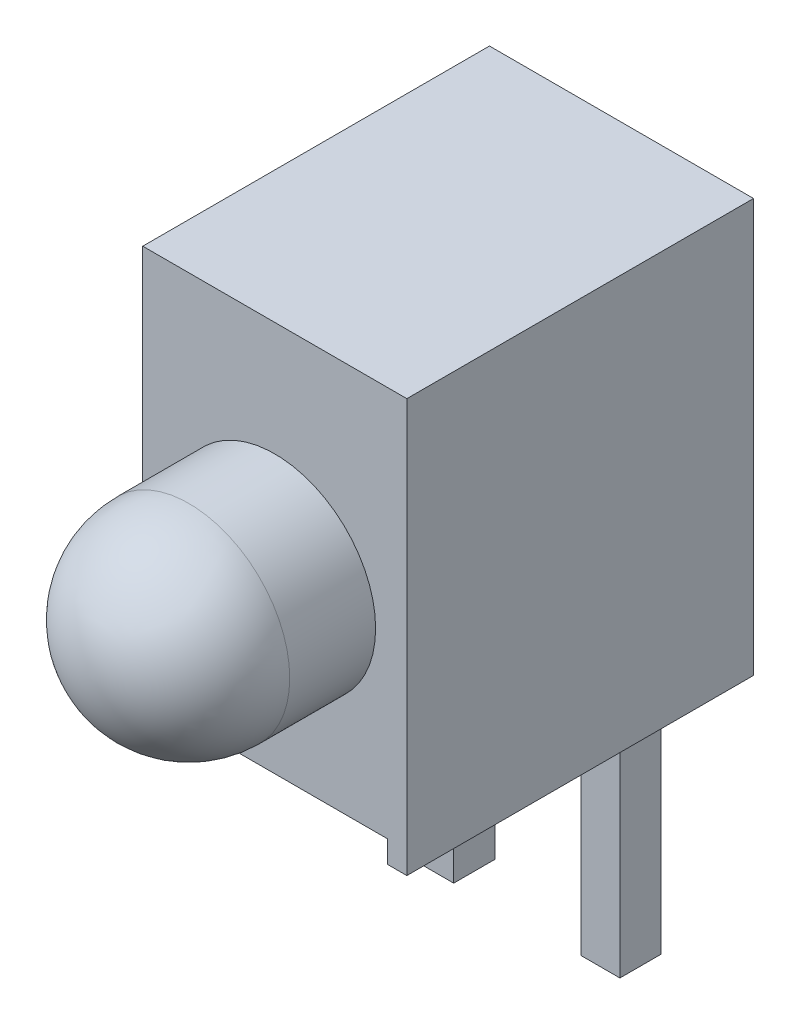
ISO-10303-21;
HEADER;
FILE_DESCRIPTION(('STEP AP214'),'2;1');
FILE_NAME('part.step','',(''),(''),'','','');
FILE_SCHEMA(('AUTOMOTIVE_DESIGN { 1 0 10303 214 1 1 1 1 }'));
ENDSEC;
DATA;
#1=APPLICATION_CONTEXT('core data for automotive mechanical design processes');
#2=APPLICATION_PROTOCOL_DEFINITION('international standard','automotive_design',2000,#1);
#3=PRODUCT_CONTEXT('',#1,'mechanical');
#4=PRODUCT('Part','Part','',(#3));
#5=PRODUCT_RELATED_PRODUCT_CATEGORY('part','',(#4));
#6=PRODUCT_DEFINITION_FORMATION('','',#4);
#7=PRODUCT_DEFINITION_CONTEXT('part definition',#1,'design');
#8=PRODUCT_DEFINITION('design','',#6,#7);
#9=PRODUCT_DEFINITION_SHAPE('','',#8);
#10=(LENGTH_UNIT() NAMED_UNIT(*) SI_UNIT(.MILLI.,.METRE.));
#11=(NAMED_UNIT(*) PLANE_ANGLE_UNIT() SI_UNIT($,.RADIAN.));
#12=(NAMED_UNIT(*) SI_UNIT($,.STERADIAN.) SOLID_ANGLE_UNIT());
#13=UNCERTAINTY_MEASURE_WITH_UNIT(LENGTH_MEASURE(1.E-05),#10,'distance_accuracy_value','');
#14=(GEOMETRIC_REPRESENTATION_CONTEXT(3) GLOBAL_UNCERTAINTY_ASSIGNED_CONTEXT((#13)) GLOBAL_UNIT_ASSIGNED_CONTEXT((#10,
#11,#12)) REPRESENTATION_CONTEXT('',''));
#15=CARTESIAN_POINT('',(0.,0.,0.));
#16=DIRECTION('',(0.,0.,1.));
#17=DIRECTION('',(1.,0.,0.));
#18=AXIS2_PLACEMENT_3D('',#15,#16,#17);
#19=CARTESIAN_POINT('',(-1.76265219475498,0.340679682989574,-2.665));
#20=DIRECTION('',(0.,1.,0.));
#21=DIRECTION('',(0.,0.,1.));
#22=AXIS2_PLACEMENT_3D('',#19,#20,#21);
#23=PLANE('',#22);
#24=DIRECTION('',(0.,0.,1.));
#25=VECTOR('',#24,1.);
#26=CARTESIAN_POINT('',(-0.978193782188084,0.340679682989574,-1.06361068465663));
#27=LINE('',#26,#25);
#28=CARTESIAN_POINT('',(-0.978193782188084,0.340679682989574,-1.69638974033212));
#29=VERTEX_POINT('',#28);
#30=CARTESIAN_POINT('',(-0.978193782188084,0.340679682989574,-1.06361068465663));
#31=VERTEX_POINT('',#30);
#32=EDGE_CURVE('E166',#29,#31,#27,.T.);
#33=ORIENTED_EDGE('',*,*,#32,.F.);
#34=DIRECTION('',(1.,0.,0.));
#35=VECTOR('',#34,1.);
#36=CARTESIAN_POINT('',(-1.57819378218808,0.340679682989574,-1.69638974033212));
#37=LINE('',#36,#35);
#38=CARTESIAN_POINT('',(-1.57819378218808,0.340679682989574,-1.69638974033212));
#39=VERTEX_POINT('',#38);
#40=EDGE_CURVE('E179',#39,#29,#37,.T.);
#41=ORIENTED_EDGE('',*,*,#40,.F.);
#42=DIRECTION('',(0.,0.,-1.));
#43=VECTOR('',#42,1.);
#44=CARTESIAN_POINT('',(-1.57819378218808,0.340679682989574,-1.06361068465663));
#45=LINE('',#44,#43);
#46=CARTESIAN_POINT('',(-1.57819378218808,0.340679682989574,-1.06361068465663));
#47=VERTEX_POINT('',#46);
#48=EDGE_CURVE('E188',#47,#39,#45,.T.);
#49=ORIENTED_EDGE('',*,*,#48,.F.);
#50=DIRECTION('',(-1.,0.,0.));
#51=VECTOR('',#50,1.);
#52=CARTESIAN_POINT('',(-1.57819378218808,0.340679682989574,-1.06361068465663));
#53=LINE('',#52,#51);
#54=EDGE_CURVE('E169',#31,#47,#53,.T.);
#55=ORIENTED_EDGE('',*,*,#54,.F.);
#56=EDGE_LOOP('',(#33,#41,#49,#55));
#57=FACE_BOUND('',#56,.T.);
#58=DIRECTION('',(-1.,0.,0.));
#59=VECTOR('',#58,1.);
#60=CARTESIAN_POINT('',(-1.76265219475498,0.340679682989574,2.665));
#61=LINE('',#60,#59);
#62=CARTESIAN_POINT('',(1.73117626270579,0.340679682989574,2.665));
#63=VERTEX_POINT('',#62);
#64=CARTESIAN_POINT('',(-1.76265219475498,0.340679682989574,2.665));
#65=VERTEX_POINT('',#64);
#66=EDGE_CURVE('E209',#63,#65,#61,.T.);
#67=ORIENTED_EDGE('',*,*,#66,.T.);
#68=DIRECTION('',(0.,0.,1.));
#69=VECTOR('',#68,1.);
#70=CARTESIAN_POINT('',(-1.76265219475498,0.340679682989574,-2.665));
#71=LINE('',#70,#69);
#72=CARTESIAN_POINT('',(-1.76265219475498,0.340679682989574,-2.665));
#73=VERTEX_POINT('',#72);
#74=EDGE_CURVE('E222',#73,#65,#71,.T.);
#75=ORIENTED_EDGE('',*,*,#74,.F.);
#76=DIRECTION('',(-1.,0.,0.));
#77=VECTOR('',#76,1.);
#78=CARTESIAN_POINT('',(-1.76265219475498,0.340679682989574,-2.665));
#79=LINE('',#78,#77);
#80=CARTESIAN_POINT('',(1.73117626270579,0.340679682989574,-2.665));
#81=VERTEX_POINT('',#80);
#82=EDGE_CURVE('E212',#81,#73,#79,.T.);
#83=ORIENTED_EDGE('',*,*,#82,.F.);
#84=DIRECTION('',(0.,0.,1.));
#85=VECTOR('',#84,1.);
#86=CARTESIAN_POINT('',(1.73117626270579,0.340679682989574,-2.665));
#87=LINE('',#86,#85);
#88=EDGE_CURVE('E225',#81,#63,#87,.T.);
#89=ORIENTED_EDGE('',*,*,#88,.T.);
#90=EDGE_LOOP('',(#67,#75,#83,#89));
#91=FACE_BOUND('',#90,.T.);
#92=DIRECTION('',(0.,0.,1.));
#93=VECTOR('',#92,1.);
#94=CARTESIAN_POINT('',(1.56180621781192,0.340679682989574,-1.07861047216225));
#95=LINE('',#94,#93);
#96=CARTESIAN_POINT('',(1.56180621781192,0.340679682989574,-1.71138952783774));
#97=VERTEX_POINT('',#96);
#98=CARTESIAN_POINT('',(1.56180621781192,0.340679682989574,-1.07861047216225));
#99=VERTEX_POINT('',#98);
#100=EDGE_CURVE('E165',#97,#99,#95,.T.);
#101=ORIENTED_EDGE('',*,*,#100,.F.);
#102=DIRECTION('',(1.,0.,0.));
#103=VECTOR('',#102,1.);
#104=CARTESIAN_POINT('',(0.961806217811916,0.340679682989574,-1.71138952783774));
#105=LINE('',#104,#103);
#106=CARTESIAN_POINT('',(0.961806217811916,0.340679682989574,-1.71138952783774));
#107=VERTEX_POINT('',#106);
#108=EDGE_CURVE('E162',#107,#97,#105,.T.);
#109=ORIENTED_EDGE('',*,*,#108,.F.);
#110=DIRECTION('',(0.,0.,-1.));
#111=VECTOR('',#110,1.);
#112=CARTESIAN_POINT('',(0.961806217811916,0.340679682989574,-1.07861047216225));
#113=LINE('',#112,#111);
#114=CARTESIAN_POINT('',(0.961806217811916,0.340679682989574,-1.07861047216225));
#115=VERTEX_POINT('',#114);
#116=EDGE_CURVE('E52',#115,#107,#113,.T.);
#117=ORIENTED_EDGE('',*,*,#116,.F.);
#118=DIRECTION('',(-1.,0.,0.));
#119=VECTOR('',#118,1.);
#120=CARTESIAN_POINT('',(0.961806217811916,0.340679682989574,-1.07861047216225));
#121=LINE('',#120,#119);
#122=EDGE_CURVE('E47',#99,#115,#121,.T.);
#123=ORIENTED_EDGE('',*,*,#122,.F.);
#124=EDGE_LOOP('',(#101,#109,#117,#123));
#125=FACE_BOUND('',#124,.T.);
#126=ADVANCED_FACE('F32',(#57,#91,#125),#23,.F.);
#127=CARTESIAN_POINT('',(2.03,0.,2.665));
#128=DIRECTION('',(0.,1.,0.));
#129=DIRECTION('',(0.,0.,1.));
#130=AXIS2_PLACEMENT_3D('',#127,#128,#129);
#131=PLANE('',#130);
#132=DIRECTION('',(-1.,0.,0.));
#133=VECTOR('',#132,1.);
#134=CARTESIAN_POINT('',(-2.03,0.,-2.665));
#135=LINE('',#134,#133);
#136=CARTESIAN_POINT('',(-1.76265219475498,0.,-2.665));
#137=VERTEX_POINT('',#136);
#138=CARTESIAN_POINT('',(-2.03,0.,-2.665));
#139=VERTEX_POINT('',#138);
#140=EDGE_CURVE('E244',#137,#139,#135,.T.);
#141=ORIENTED_EDGE('',*,*,#140,.F.);
#142=DIRECTION('',(0.,0.,1.));
#143=VECTOR('',#142,1.);
#144=CARTESIAN_POINT('',(-1.76265219475498,0.,-2.665));
#145=LINE('',#144,#143);
#146=CARTESIAN_POINT('',(-1.76265219475498,0.,2.665));
#147=VERTEX_POINT('',#146);
#148=EDGE_CURVE('E215',#137,#147,#145,.T.);
#149=ORIENTED_EDGE('',*,*,#148,.T.);
#150=DIRECTION('',(1.,0.,0.));
#151=VECTOR('',#150,1.);
#152=CARTESIAN_POINT('',(-2.03,0.,2.665));
#153=LINE('',#152,#151);
#154=CARTESIAN_POINT('',(-2.03,0.,2.665));
#155=VERTEX_POINT('',#154);
#156=EDGE_CURVE('E235',#155,#147,#153,.T.);
#157=ORIENTED_EDGE('',*,*,#156,.F.);
#158=DIRECTION('',(0.,0.,1.));
#159=VECTOR('',#158,1.);
#160=CARTESIAN_POINT('',(-2.03,0.,-2.665));
#161=LINE('',#160,#159);
#162=EDGE_CURVE('E248',#139,#155,#161,.T.);
#163=ORIENTED_EDGE('',*,*,#162,.F.);
#164=EDGE_LOOP('',(#141,#149,#157,#163));
#165=FACE_BOUND('',#164,.T.);
#166=ADVANCED_FACE('F271',(#165),#131,.F.);
#167=CARTESIAN_POINT('',(-2.03,6.35,2.665));
#168=DIRECTION('',(0.,0.,-1.));
#169=DIRECTION('',(-1.,0.,0.));
#170=AXIS2_PLACEMENT_3D('',#167,#168,#169);
#171=PLANE('',#170);
#172=ORIENTED_EDGE('',*,*,#156,.T.);
#173=DIRECTION('',(0.,-1.,0.));
#174=VECTOR('',#173,1.);
#175=CARTESIAN_POINT('',(-1.76265219475498,0.,2.665));
#176=LINE('',#175,#174);
#177=EDGE_CURVE('E204',#65,#147,#176,.T.);
#178=ORIENTED_EDGE('',*,*,#177,.F.);
#179=ORIENTED_EDGE('',*,*,#66,.F.);
#180=DIRECTION('',(0.,1.,0.));
#181=VECTOR('',#180,1.);
#182=CARTESIAN_POINT('',(1.73117626270579,0.,2.665));
#183=LINE('',#182,#181);
#184=CARTESIAN_POINT('',(1.73117626270579,0.,2.665));
#185=VERTEX_POINT('',#184);
#186=EDGE_CURVE('E217',#185,#63,#183,.T.);
#187=ORIENTED_EDGE('',*,*,#186,.F.);
#188=CARTESIAN_POINT('',(2.03,0.,2.665));
#189=VERTEX_POINT('',#188);
#190=EDGE_CURVE('E250',#185,#189,#153,.T.);
#191=ORIENTED_EDGE('',*,*,#190,.T.);
#192=DIRECTION('',(0.,-1.,0.));
#193=VECTOR('',#192,1.);
#194=CARTESIAN_POINT('',(2.03,6.35,2.665));
#195=LINE('',#194,#193);
#196=CARTESIAN_POINT('',(2.03,6.35,2.665));
#197=VERTEX_POINT('',#196);
#198=EDGE_CURVE('E241',#197,#189,#195,.T.);
#199=ORIENTED_EDGE('',*,*,#198,.F.);
#200=DIRECTION('',(1.,0.,0.));
#201=VECTOR('',#200,1.);
#202=CARTESIAN_POINT('',(-2.03,6.35,2.665));
#203=LINE('',#202,#201);
#204=CARTESIAN_POINT('',(-2.03,6.35,2.665));
#205=VERTEX_POINT('',#204);
#206=EDGE_CURVE('E239',#205,#197,#203,.T.);
#207=ORIENTED_EDGE('',*,*,#206,.F.);
#208=DIRECTION('',(0.,-1.,0.));
#209=VECTOR('',#208,1.);
#210=CARTESIAN_POINT('',(-2.03,6.35,2.665));
#211=LINE('',#210,#209);
#212=EDGE_CURVE('E255',#205,#155,#211,.T.);
#213=ORIENTED_EDGE('',*,*,#212,.T.);
#214=EDGE_LOOP('',(#172,#178,#179,#187,#191,#199,#207,#213));
#215=FACE_BOUND('',#214,.T.);
#216=CARTESIAN_POINT('',(0.,3.05,2.665));
#217=DIRECTION('',(0.,0.,-1.));
#218=DIRECTION('',(-1.,0.,0.));
#219=AXIS2_PLACEMENT_3D('',#216,#217,#218);
#220=CIRCLE('',#219,1.55);
#221=CARTESIAN_POINT('',(-1.55,3.05,2.665));
#222=VERTEX_POINT('',#221);
#223=EDGE_CURVE('E40',#222,#222,#220,.F.);
#224=ORIENTED_EDGE('',*,*,#223,.F.);
#225=EDGE_LOOP('',(#224));
#226=FACE_BOUND('',#225,.T.);
#227=ADVANCED_FACE('F268',(#215,#226),#171,.F.);
#228=CARTESIAN_POINT('',(2.03,6.35,-2.665));
#229=DIRECTION('',(-1.,0.,0.));
#230=DIRECTION('',(0.,0.,1.));
#231=AXIS2_PLACEMENT_3D('',#228,#229,#230);
#232=PLANE('',#231);
#233=DIRECTION('',(0.,0.,-1.));
#234=VECTOR('',#233,1.);
#235=CARTESIAN_POINT('',(2.03,0.,-2.665));
#236=LINE('',#235,#234);
#237=CARTESIAN_POINT('',(2.03,0.,-2.665));
#238=VERTEX_POINT('',#237);
#239=EDGE_CURVE('E224',#189,#238,#236,.T.);
#240=ORIENTED_EDGE('',*,*,#239,.T.);
#241=DIRECTION('',(0.,-1.,0.));
#242=VECTOR('',#241,1.);
#243=CARTESIAN_POINT('',(2.03,6.35,-2.665));
#244=LINE('',#243,#242);
#245=CARTESIAN_POINT('',(2.03,6.35,-2.665));
#246=VERTEX_POINT('',#245);
#247=EDGE_CURVE('E261',#246,#238,#244,.T.);
#248=ORIENTED_EDGE('',*,*,#247,.F.);
#249=DIRECTION('',(0.,0.,-1.));
#250=VECTOR('',#249,1.);
#251=CARTESIAN_POINT('',(2.03,6.35,-2.665));
#252=LINE('',#251,#250);
#253=EDGE_CURVE('E231',#197,#246,#252,.T.);
#254=ORIENTED_EDGE('',*,*,#253,.F.);
#255=ORIENTED_EDGE('',*,*,#198,.T.);
#256=EDGE_LOOP('',(#240,#248,#254,#255));
#257=FACE_BOUND('',#256,.T.);
#258=ADVANCED_FACE('F270',(#257),#232,.F.);
#259=CARTESIAN_POINT('',(-2.03,6.35,-2.665));
#260=DIRECTION('',(0.,0.,1.));
#261=DIRECTION('',(1.,0.,0.));
#262=AXIS2_PLACEMENT_3D('',#259,#260,#261);
#263=PLANE('',#262);
#264=ORIENTED_EDGE('',*,*,#82,.T.);
#265=DIRECTION('',(0.,-1.,0.));
#266=VECTOR('',#265,1.);
#267=CARTESIAN_POINT('',(-1.76265219475498,0.,-2.665));
#268=LINE('',#267,#266);
#269=EDGE_CURVE('E205',#73,#137,#268,.T.);
#270=ORIENTED_EDGE('',*,*,#269,.T.);
#271=ORIENTED_EDGE('',*,*,#140,.T.);
#272=DIRECTION('',(0.,-1.,0.));
#273=VECTOR('',#272,1.);
#274=CARTESIAN_POINT('',(-2.03,6.35,-2.665));
#275=LINE('',#274,#273);
#276=CARTESIAN_POINT('',(-2.03,6.35,-2.665));
#277=VERTEX_POINT('',#276);
#278=EDGE_CURVE('E258',#277,#139,#275,.T.);
#279=ORIENTED_EDGE('',*,*,#278,.F.);
#280=DIRECTION('',(-1.,0.,0.));
#281=VECTOR('',#280,1.);
#282=CARTESIAN_POINT('',(-2.03,6.35,-2.665));
#283=LINE('',#282,#281);
#284=EDGE_CURVE('E234',#246,#277,#283,.T.);
#285=ORIENTED_EDGE('',*,*,#284,.F.);
#286=ORIENTED_EDGE('',*,*,#247,.T.);
#287=CARTESIAN_POINT('',(1.73117626270579,0.,-2.665));
#288=VERTEX_POINT('',#287);
#289=EDGE_CURVE('E245',#238,#288,#135,.T.);
#290=ORIENTED_EDGE('',*,*,#289,.T.);
#291=DIRECTION('',(0.,1.,0.));
#292=VECTOR('',#291,1.);
#293=CARTESIAN_POINT('',(1.73117626270579,0.,-2.665));
#294=LINE('',#293,#292);
#295=EDGE_CURVE('E208',#288,#81,#294,.T.);
#296=ORIENTED_EDGE('',*,*,#295,.T.);
#297=EDGE_LOOP('',(#264,#270,#271,#279,#285,#286,#290,#296));
#298=FACE_BOUND('',#297,.T.);
#299=ADVANCED_FACE('F278',(#298),#263,.F.);
#300=CARTESIAN_POINT('',(-2.03,6.35,-2.665));
#301=DIRECTION('',(1.,0.,0.));
#302=DIRECTION('',(0.,0.,-1.));
#303=AXIS2_PLACEMENT_3D('',#300,#301,#302);
#304=PLANE('',#303);
#305=ORIENTED_EDGE('',*,*,#162,.T.);
#306=ORIENTED_EDGE('',*,*,#212,.F.);
#307=DIRECTION('',(0.,0.,1.));
#308=VECTOR('',#307,1.);
#309=CARTESIAN_POINT('',(-2.03,6.35,-2.665));
#310=LINE('',#309,#308);
#311=EDGE_CURVE('E237',#277,#205,#310,.T.);
#312=ORIENTED_EDGE('',*,*,#311,.F.);
#313=ORIENTED_EDGE('',*,*,#278,.T.);
#314=EDGE_LOOP('',(#305,#306,#312,#313));
#315=FACE_BOUND('',#314,.T.);
#316=ADVANCED_FACE('F307',(#315),#304,.F.);
#317=CARTESIAN_POINT('',(2.03,6.35,2.665));
#318=DIRECTION('',(0.,1.,0.));
#319=DIRECTION('',(0.,0.,1.));
#320=AXIS2_PLACEMENT_3D('',#317,#318,#319);
#321=PLANE('',#320);
#322=ORIENTED_EDGE('',*,*,#253,.T.);
#323=ORIENTED_EDGE('',*,*,#284,.T.);
#324=ORIENTED_EDGE('',*,*,#311,.T.);
#325=ORIENTED_EDGE('',*,*,#206,.T.);
#326=EDGE_LOOP('',(#322,#323,#324,#325));
#327=FACE_BOUND('',#326,.T.);
#328=ADVANCED_FACE('F305',(#327),#321,.T.);
#329=ORIENTED_EDGE('',*,*,#190,.F.);
#330=DIRECTION('',(0.,0.,1.));
#331=VECTOR('',#330,1.);
#332=CARTESIAN_POINT('',(1.73117626270579,0.,-2.665));
#333=LINE('',#332,#331);
#334=EDGE_CURVE('E227',#288,#185,#333,.T.);
#335=ORIENTED_EDGE('',*,*,#334,.F.);
#336=ORIENTED_EDGE('',*,*,#289,.F.);
#337=ORIENTED_EDGE('',*,*,#239,.F.);
#338=EDGE_LOOP('',(#329,#335,#336,#337));
#339=FACE_BOUND('',#338,.T.);
#340=ADVANCED_FACE('F282',(#339),#131,.F.);
#341=CARTESIAN_POINT('',(0.,3.05,5.5352));
#342=DIRECTION('',(0.,0.,-1.));
#343=DIRECTION('',(-1.,0.,0.));
#344=AXIS2_PLACEMENT_3D('',#341,#342,#343);
#345=CYLINDRICAL_SURFACE('',#344,1.55);
#346=CARTESIAN_POINT('',(0.,3.05,3.9852));
#347=DIRECTION('',(0.,0.,-1.));
#348=DIRECTION('',(-1.,0.,0.));
#349=AXIS2_PLACEMENT_3D('',#346,#347,#348);
#350=CIRCLE('',#349,1.55);
#351=CARTESIAN_POINT('',(-1.55,3.05,3.9852));
#352=VERTEX_POINT('',#351);
#353=EDGE_CURVE('E11',#352,#352,#350,.T.);
#354=CARTESIAN_POINT('',(-1.55,3.05,3.9852));
#355=CARTESIAN_POINT('',(-1.55,3.05,3.97144791666667));
#356=CARTESIAN_POINT('',(-1.55,3.05,3.95769583333334));
#357=CARTESIAN_POINT('',(-1.55,3.05,3.93019166666667));
#358=CARTESIAN_POINT('',(-1.55,3.05,3.91643958333334));
#359=CARTESIAN_POINT('',(-1.55,3.05,3.88893541666667));
#360=CARTESIAN_POINT('',(-1.55,3.05,3.87518333333334));
#361=CARTESIAN_POINT('',(-1.55,3.05,3.84767916666667));
#362=CARTESIAN_POINT('',(-1.55,3.05,3.83392708333334));
#363=CARTESIAN_POINT('',(-1.55,3.05,3.80642291666667));
#364=CARTESIAN_POINT('',(-1.55,3.05,3.79267083333334));
#365=CARTESIAN_POINT('',(-1.55,3.05,3.76516666666667));
#366=CARTESIAN_POINT('',(-1.55,3.05,3.75141458333334));
#367=CARTESIAN_POINT('',(-1.55,3.05,3.72391041666667));
#368=CARTESIAN_POINT('',(-1.55,3.05,3.71015833333334));
#369=CARTESIAN_POINT('',(-1.55,3.05,3.68265416666667));
#370=CARTESIAN_POINT('',(-1.55,3.05,3.66890208333334));
#371=CARTESIAN_POINT('',(-1.55,3.05,3.64139791666667));
#372=CARTESIAN_POINT('',(-1.55,3.05,3.62764583333334));
#373=CARTESIAN_POINT('',(-1.55,3.05,3.60014166666667));
#374=CARTESIAN_POINT('',(-1.55,3.05,3.58638958333334));
#375=CARTESIAN_POINT('',(-1.55,3.05,3.55888541666667));
#376=CARTESIAN_POINT('',(-1.55,3.05,3.54513333333334));
#377=CARTESIAN_POINT('',(-1.55,3.05,3.51762916666667));
#378=CARTESIAN_POINT('',(-1.55,3.05,3.50387708333334));
#379=CARTESIAN_POINT('',(-1.55,3.05,3.47637291666667));
#380=CARTESIAN_POINT('',(-1.55,3.05,3.46262083333334));
#381=CARTESIAN_POINT('',(-1.55,3.05,3.43511666666667));
#382=CARTESIAN_POINT('',(-1.55,3.05,3.42136458333334));
#383=CARTESIAN_POINT('',(-1.55,3.05,3.39386041666667));
#384=CARTESIAN_POINT('',(-1.55,3.05,3.38010833333334));
#385=CARTESIAN_POINT('',(-1.55,3.05,3.35260416666667));
#386=CARTESIAN_POINT('',(-1.55,3.05,3.33885208333334));
#387=CARTESIAN_POINT('',(-1.55,3.05,3.31134791666667));
#388=CARTESIAN_POINT('',(-1.55,3.05,3.29759583333334));
#389=CARTESIAN_POINT('',(-1.55,3.05,3.27009166666667));
#390=CARTESIAN_POINT('',(-1.55,3.05,3.25633958333334));
#391=CARTESIAN_POINT('',(-1.55,3.05,3.22883541666667));
#392=CARTESIAN_POINT('',(-1.55,3.05,3.21508333333334));
#393=CARTESIAN_POINT('',(-1.55,3.05,3.18757916666667));
#394=CARTESIAN_POINT('',(-1.55,3.05,3.17382708333334));
#395=CARTESIAN_POINT('',(-1.55,3.05,3.14632291666667));
#396=CARTESIAN_POINT('',(-1.55,3.05,3.13257083333334));
#397=CARTESIAN_POINT('',(-1.55,3.05,3.10506666666667));
#398=CARTESIAN_POINT('',(-1.55,3.05,3.09131458333334));
#399=CARTESIAN_POINT('',(-1.55,3.05,3.06381041666667));
#400=CARTESIAN_POINT('',(-1.55,3.05,3.05005833333334));
#401=CARTESIAN_POINT('',(-1.55,3.05,3.02255416666667));
#402=CARTESIAN_POINT('',(-1.55,3.05,3.00880208333334));
#403=CARTESIAN_POINT('',(-1.55,3.05,2.98129791666667));
#404=CARTESIAN_POINT('',(-1.55,3.05,2.96754583333334));
#405=CARTESIAN_POINT('',(-1.55,3.05,2.94004166666667));
#406=CARTESIAN_POINT('',(-1.55,3.05,2.92628958333334));
#407=CARTESIAN_POINT('',(-1.55,3.05,2.89878541666667));
#408=CARTESIAN_POINT('',(-1.55,3.05,2.88503333333334));
#409=CARTESIAN_POINT('',(-1.55,3.05,2.85752916666667));
#410=CARTESIAN_POINT('',(-1.55,3.05,2.84377708333334));
#411=CARTESIAN_POINT('',(-1.55,3.05,2.81627291666667));
#412=CARTESIAN_POINT('',(-1.55,3.05,2.80252083333334));
#413=CARTESIAN_POINT('',(-1.55,3.05,2.77501666666667));
#414=CARTESIAN_POINT('',(-1.55,3.05,2.76126458333334));
#415=CARTESIAN_POINT('',(-1.55,3.05,2.73376041666667));
#416=CARTESIAN_POINT('',(-1.55,3.05,2.72000833333334));
#417=CARTESIAN_POINT('',(-1.55,3.05,2.69250416666667));
#418=CARTESIAN_POINT('',(-1.55,3.05,2.67875208333334));
#419=CARTESIAN_POINT('',(-1.55,3.05,2.665));
#420=B_SPLINE_CURVE_WITH_KNOTS('',3,(#354,#355,#356,#357,#358,#359,#360,#361,#362,#363,#364,
#365,#366,#367,#368,#369,#370,#371,#372,#373,#374,#375,#376,#377,#378,#379,#380,#381,#382,#383,
#384,#385,#386,#387,#388,#389,#390,#391,#392,#393,#394,#395,#396,#397,#398,#399,#400,#401,#402,
#403,#404,#405,#406,#407,#408,#409,#410,#411,#412,#413,#414,#415,#416,#417,#418,#419),
.UNSPECIFIED.,.F.,.F.,(4,2,2,2,2,2,2,2,2,2,2,2,2,2,2,2,2,2,2,2,2,2,2,2,2,2,2,2,2,2,2,2,4),(0.,
0.0412562499999998,0.0825124999999996,0.12376875,0.165025,0.20628125,0.2475375,0.28879375,
0.33005,0.37130625,0.4125625,0.45381875,0.495075,0.53633125,0.5775875,0.61884375,0.6601,
0.70135625,0.7426125,0.78386875,0.825125,0.86638125,0.9076375,0.94889375,0.99015,1.03140625,
1.0726625,1.11391875,1.155175,1.19643125,1.2376875,1.27894375,1.3202),.UNSPECIFIED.);
#421=EDGE_CURVE('BSEAM266',#352,#222,#420,.T.);
#422=ORIENTED_EDGE('',*,*,#353,.T.);
#423=ORIENTED_EDGE('',*,*,#223,.T.);
#424=ORIENTED_EDGE('',*,*,#421,.T.);
#425=ORIENTED_EDGE('',*,*,#421,.F.);
#426=EDGE_LOOP('',(#422,#424,#423,#425));
#427=FACE_BOUND('',#426,.T.);
#428=ADVANCED_FACE('F266',(#427),#345,.T.);
#429=CARTESIAN_POINT('',(0.,3.05,3.9852));
#430=DIRECTION('',(0.,0.,1.));
#431=DIRECTION('',(1.,0.,0.));
#432=AXIS2_PLACEMENT_3D('',#429,#430,#431);
#433=SPHERICAL_SURFACE('',#432,1.55);
#434=ORIENTED_EDGE('',*,*,#353,.F.);
#435=EDGE_LOOP('',(#434));
#436=FACE_BOUND('',#435,.T.);
#437=ADVANCED_FACE('F34',(#436),#433,.T.);
#438=CARTESIAN_POINT('',(-1.76265219475498,0.,-2.665));
#439=DIRECTION('',(-1.,0.,0.));
#440=DIRECTION('',(0.,0.,1.));
#441=AXIS2_PLACEMENT_3D('',#438,#439,#440);
#442=PLANE('',#441);
#443=ORIENTED_EDGE('',*,*,#177,.T.);
#444=ORIENTED_EDGE('',*,*,#148,.F.);
#445=ORIENTED_EDGE('',*,*,#269,.F.);
#446=ORIENTED_EDGE('',*,*,#74,.T.);
#447=EDGE_LOOP('',(#443,#444,#445,#446));
#448=FACE_BOUND('',#447,.T.);
#449=ADVANCED_FACE('F297',(#448),#442,.F.);
#450=CARTESIAN_POINT('',(1.73117626270579,0.,-2.665));
#451=DIRECTION('',(1.,0.,0.));
#452=DIRECTION('',(0.,0.,-1.));
#453=AXIS2_PLACEMENT_3D('',#450,#451,#452);
#454=PLANE('',#453);
#455=ORIENTED_EDGE('',*,*,#186,.T.);
#456=ORIENTED_EDGE('',*,*,#88,.F.);
#457=ORIENTED_EDGE('',*,*,#295,.F.);
#458=ORIENTED_EDGE('',*,*,#334,.T.);
#459=EDGE_LOOP('',(#455,#456,#457,#458));
#460=FACE_BOUND('',#459,.T.);
#461=ADVANCED_FACE('F294',(#460),#454,.F.);
#462=CARTESIAN_POINT('',(-0.978193782188084,-3.46932031701043,-1.06361068465663));
#463=DIRECTION('',(-1.,0.,0.));
#464=DIRECTION('',(0.,0.,1.));
#465=AXIS2_PLACEMENT_3D('',#462,#463,#464);
#466=PLANE('',#465);
#467=ORIENTED_EDGE('',*,*,#32,.T.);
#468=DIRECTION('',(0.,1.,0.));
#469=VECTOR('',#468,1.);
#470=CARTESIAN_POINT('',(-0.978193782188084,-3.46932031701043,-1.06361068465663));
#471=LINE('',#470,#469);
#472=CARTESIAN_POINT('',(-0.978193782188084,-3.46932031701043,-1.06361068465663));
#473=VERTEX_POINT('',#472);
#474=EDGE_CURVE('E201',#473,#31,#471,.T.);
#475=ORIENTED_EDGE('',*,*,#474,.F.);
#476=DIRECTION('',(0.,0.,1.));
#477=VECTOR('',#476,1.);
#478=CARTESIAN_POINT('',(-0.978193782188084,-3.46932031701043,-1.06361068465663));
#479=LINE('',#478,#477);
#480=CARTESIAN_POINT('',(-0.978193782188084,-3.46932031701043,-1.69638974033212));
#481=VERTEX_POINT('',#480);
#482=EDGE_CURVE('E175',#481,#473,#479,.T.);
#483=ORIENTED_EDGE('',*,*,#482,.F.);
#484=DIRECTION('',(0.,1.,0.));
#485=VECTOR('',#484,1.);
#486=CARTESIAN_POINT('',(-0.978193782188084,-3.46932031701043,-1.69638974033212));
#487=LINE('',#486,#485);
#488=EDGE_CURVE('E184',#481,#29,#487,.T.);
#489=ORIENTED_EDGE('',*,*,#488,.T.);
#490=EDGE_LOOP('',(#467,#475,#483,#489));
#491=FACE_BOUND('',#490,.T.);
#492=ADVANCED_FACE('F292',(#491),#466,.F.);
#493=CARTESIAN_POINT('',(-1.57819378218808,-3.46932031701043,-1.06361068465663));
#494=DIRECTION('',(0.,0.,-1.));
#495=DIRECTION('',(-1.,0.,0.));
#496=AXIS2_PLACEMENT_3D('',#493,#494,#495);
#497=PLANE('',#496);
#498=ORIENTED_EDGE('',*,*,#54,.T.);
#499=DIRECTION('',(0.,1.,0.));
#500=VECTOR('',#499,1.);
#501=CARTESIAN_POINT('',(-1.57819378218808,-3.46932031701043,-1.06361068465663));
#502=LINE('',#501,#500);
#503=CARTESIAN_POINT('',(-1.57819378218808,-3.46932031701043,-1.06361068465663));
#504=VERTEX_POINT('',#503);
#505=EDGE_CURVE('E198',#504,#47,#502,.T.);
#506=ORIENTED_EDGE('',*,*,#505,.F.);
#507=DIRECTION('',(-1.,0.,0.));
#508=VECTOR('',#507,1.);
#509=CARTESIAN_POINT('',(-1.57819378218808,-3.46932031701043,-1.06361068465663));
#510=LINE('',#509,#508);
#511=EDGE_CURVE('E178',#473,#504,#510,.T.);
#512=ORIENTED_EDGE('',*,*,#511,.F.);
#513=ORIENTED_EDGE('',*,*,#474,.T.);
#514=EDGE_LOOP('',(#498,#506,#512,#513));
#515=FACE_BOUND('',#514,.T.);
#516=ADVANCED_FACE('F370',(#515),#497,.F.);
#517=CARTESIAN_POINT('',(-1.57819378218808,-3.46932031701043,-1.06361068465663));
#518=DIRECTION('',(1.,0.,0.));
#519=DIRECTION('',(0.,0.,-1.));
#520=AXIS2_PLACEMENT_3D('',#517,#518,#519);
#521=PLANE('',#520);
#522=ORIENTED_EDGE('',*,*,#48,.T.);
#523=DIRECTION('',(0.,1.,0.));
#524=VECTOR('',#523,1.);
#525=CARTESIAN_POINT('',(-1.57819378218808,-3.46932031701043,-1.69638974033212));
#526=LINE('',#525,#524);
#527=CARTESIAN_POINT('',(-1.57819378218808,-3.46932031701043,-1.69638974033212));
#528=VERTEX_POINT('',#527);
#529=EDGE_CURVE('E195',#528,#39,#526,.T.);
#530=ORIENTED_EDGE('',*,*,#529,.F.);
#531=DIRECTION('',(0.,0.,-1.));
#532=VECTOR('',#531,1.);
#533=CARTESIAN_POINT('',(-1.57819378218808,-3.46932031701043,-1.06361068465663));
#534=LINE('',#533,#532);
#535=EDGE_CURVE('E181',#504,#528,#534,.T.);
#536=ORIENTED_EDGE('',*,*,#535,.F.);
#537=ORIENTED_EDGE('',*,*,#505,.T.);
#538=EDGE_LOOP('',(#522,#530,#536,#537));
#539=FACE_BOUND('',#538,.T.);
#540=ADVANCED_FACE('F367',(#539),#521,.F.);
#541=CARTESIAN_POINT('',(-1.57819378218808,-3.46932031701043,-1.69638974033212));
#542=DIRECTION('',(0.,0.,1.));
#543=DIRECTION('',(1.,0.,0.));
#544=AXIS2_PLACEMENT_3D('',#541,#542,#543);
#545=PLANE('',#544);
#546=ORIENTED_EDGE('',*,*,#40,.T.);
#547=ORIENTED_EDGE('',*,*,#488,.F.);
#548=DIRECTION('',(1.,0.,0.));
#549=VECTOR('',#548,1.);
#550=CARTESIAN_POINT('',(-1.57819378218808,-3.46932031701043,-1.69638974033212));
#551=LINE('',#550,#549);
#552=EDGE_CURVE('E183',#528,#481,#551,.T.);
#553=ORIENTED_EDGE('',*,*,#552,.F.);
#554=ORIENTED_EDGE('',*,*,#529,.T.);
#555=EDGE_LOOP('',(#546,#547,#553,#554));
#556=FACE_BOUND('',#555,.T.);
#557=ADVANCED_FACE('F363',(#556),#545,.F.);
#558=CARTESIAN_POINT('',(-0.978193782188084,-3.46932031701043,-1.69638974033212));
#559=DIRECTION('',(0.,-1.,0.));
#560=DIRECTION('',(0.,0.,-1.));
#561=AXIS2_PLACEMENT_3D('',#558,#559,#560);
#562=PLANE('',#561);
#563=ORIENTED_EDGE('',*,*,#482,.T.);
#564=ORIENTED_EDGE('',*,*,#511,.T.);
#565=ORIENTED_EDGE('',*,*,#535,.T.);
#566=ORIENTED_EDGE('',*,*,#552,.T.);
#567=EDGE_LOOP('',(#563,#564,#565,#566));
#568=FACE_BOUND('',#567,.T.);
#569=ADVANCED_FACE('F360',(#568),#562,.T.);
#570=CARTESIAN_POINT('',(1.56180621781192,-3.46932031701043,-1.07861047216225));
#571=DIRECTION('',(-1.,0.,0.));
#572=DIRECTION('',(0.,0.,1.));
#573=AXIS2_PLACEMENT_3D('',#570,#571,#572);
#574=PLANE('',#573);
#575=ORIENTED_EDGE('',*,*,#100,.T.);
#576=DIRECTION('',(0.,1.,0.));
#577=VECTOR('',#576,1.);
#578=CARTESIAN_POINT('',(1.56180621781192,-3.46932031701043,-1.07861047216225));
#579=LINE('',#578,#577);
#580=CARTESIAN_POINT('',(1.56180621781192,-3.46932031701043,-1.07861047216225));
#581=VERTEX_POINT('',#580);
#582=EDGE_CURVE('E146',#581,#99,#579,.T.);
#583=ORIENTED_EDGE('',*,*,#582,.F.);
#584=DIRECTION('',(0.,0.,1.));
#585=VECTOR('',#584,1.);
#586=CARTESIAN_POINT('',(1.56180621781192,-3.46932031701043,-1.07861047216225));
#587=LINE('',#586,#585);
#588=CARTESIAN_POINT('',(1.56180621781192,-3.46932031701043,-1.71138952783774));
#589=VERTEX_POINT('',#588);
#590=EDGE_CURVE('E153',#589,#581,#587,.T.);
#591=ORIENTED_EDGE('',*,*,#590,.F.);
#592=DIRECTION('',(0.,1.,0.));
#593=VECTOR('',#592,1.);
#594=CARTESIAN_POINT('',(1.56180621781192,-3.46932031701043,-1.71138952783774));
#595=LINE('',#594,#593);
#596=EDGE_CURVE('E338',#589,#97,#595,.T.);
#597=ORIENTED_EDGE('',*,*,#596,.T.);
#598=EDGE_LOOP('',(#575,#583,#591,#597));
#599=FACE_BOUND('',#598,.T.);
#600=ADVANCED_FACE('F164',(#599),#574,.F.);
#601=CARTESIAN_POINT('',(0.961806217811916,-3.46932031701043,-1.07861047216225));
#602=DIRECTION('',(0.,0.,-1.));
#603=DIRECTION('',(-1.,0.,0.));
#604=AXIS2_PLACEMENT_3D('',#601,#602,#603);
#605=PLANE('',#604);
#606=ORIENTED_EDGE('',*,*,#122,.T.);
#607=DIRECTION('',(0.,1.,0.));
#608=VECTOR('',#607,1.);
#609=CARTESIAN_POINT('',(0.961806217811916,-3.46932031701043,-1.07861047216225));
#610=LINE('',#609,#608);
#611=CARTESIAN_POINT('',(0.961806217811916,-3.46932031701043,-1.07861047216225));
#612=VERTEX_POINT('',#611);
#613=EDGE_CURVE('E149',#612,#115,#610,.T.);
#614=ORIENTED_EDGE('',*,*,#613,.F.);
#615=DIRECTION('',(-1.,0.,0.));
#616=VECTOR('',#615,1.);
#617=CARTESIAN_POINT('',(0.961806217811916,-3.46932031701043,-1.07861047216225));
#618=LINE('',#617,#616);
#619=EDGE_CURVE('E142',#581,#612,#618,.T.);
#620=ORIENTED_EDGE('',*,*,#619,.F.);
#621=ORIENTED_EDGE('',*,*,#582,.T.);
#622=EDGE_LOOP('',(#606,#614,#620,#621));
#623=FACE_BOUND('',#622,.T.);
#624=ADVANCED_FACE('F144',(#623),#605,.F.);
#625=CARTESIAN_POINT('',(0.961806217811916,-3.46932031701043,-1.07861047216225));
#626=DIRECTION('',(1.,0.,0.));
#627=DIRECTION('',(0.,0.,-1.));
#628=AXIS2_PLACEMENT_3D('',#625,#626,#627);
#629=PLANE('',#628);
#630=ORIENTED_EDGE('',*,*,#116,.T.);
#631=DIRECTION('',(0.,1.,0.));
#632=VECTOR('',#631,1.);
#633=CARTESIAN_POINT('',(0.961806217811916,-3.46932031701043,-1.71138952783774));
#634=LINE('',#633,#632);
#635=CARTESIAN_POINT('',(0.961806217811916,-3.46932031701043,-1.71138952783774));
#636=VERTEX_POINT('',#635);
#637=EDGE_CURVE('E171',#636,#107,#634,.T.);
#638=ORIENTED_EDGE('',*,*,#637,.F.);
#639=DIRECTION('',(0.,0.,-1.));
#640=VECTOR('',#639,1.);
#641=CARTESIAN_POINT('',(0.961806217811916,-3.46932031701043,-1.07861047216225));
#642=LINE('',#641,#640);
#643=EDGE_CURVE('E152',#612,#636,#642,.T.);
#644=ORIENTED_EDGE('',*,*,#643,.F.);
#645=ORIENTED_EDGE('',*,*,#613,.T.);
#646=EDGE_LOOP('',(#630,#638,#644,#645));
#647=FACE_BOUND('',#646,.T.);
#648=ADVANCED_FACE('F347',(#647),#629,.F.);
#649=CARTESIAN_POINT('',(0.961806217811916,-3.46932031701043,-1.71138952783774));
#650=DIRECTION('',(0.,0.,1.));
#651=DIRECTION('',(1.,0.,0.));
#652=AXIS2_PLACEMENT_3D('',#649,#650,#651);
#653=PLANE('',#652);
#654=ORIENTED_EDGE('',*,*,#108,.T.);
#655=ORIENTED_EDGE('',*,*,#596,.F.);
#656=DIRECTION('',(1.,0.,0.));
#657=VECTOR('',#656,1.);
#658=CARTESIAN_POINT('',(0.961806217811916,-3.46932031701043,-1.71138952783774));
#659=LINE('',#658,#657);
#660=EDGE_CURVE('E158',#636,#589,#659,.T.);
#661=ORIENTED_EDGE('',*,*,#660,.F.);
#662=ORIENTED_EDGE('',*,*,#637,.T.);
#663=EDGE_LOOP('',(#654,#655,#661,#662));
#664=FACE_BOUND('',#663,.T.);
#665=ADVANCED_FACE('F337',(#664),#653,.F.);
#666=CARTESIAN_POINT('',(1.56180621781192,-3.46932031701043,-1.71138952783774));
#667=DIRECTION('',(0.,-1.,0.));
#668=DIRECTION('',(0.,0.,-1.));
#669=AXIS2_PLACEMENT_3D('',#666,#667,#668);
#670=PLANE('',#669);
#671=ORIENTED_EDGE('',*,*,#590,.T.);
#672=ORIENTED_EDGE('',*,*,#619,.T.);
#673=ORIENTED_EDGE('',*,*,#643,.T.);
#674=ORIENTED_EDGE('',*,*,#660,.T.);
#675=EDGE_LOOP('',(#671,#672,#673,#674));
#676=FACE_BOUND('',#675,.T.);
#677=ADVANCED_FACE('F156',(#676),#670,.T.);
#678=CLOSED_SHELL('',(#126,#166,#227,#258,#299,#316,#328,#340,#428,#437,#449,#461,#492,#516,
#540,#557,#569,#600,#624,#648,#665,#677));
#679=MANIFOLD_SOLID_BREP('B2',#678);
#680=ADVANCED_BREP_SHAPE_REPRESENTATION('',(#18,#679),#14);
#681=SHAPE_DEFINITION_REPRESENTATION(#9,#680);
ENDSEC;
END-ISO-10303-21;
